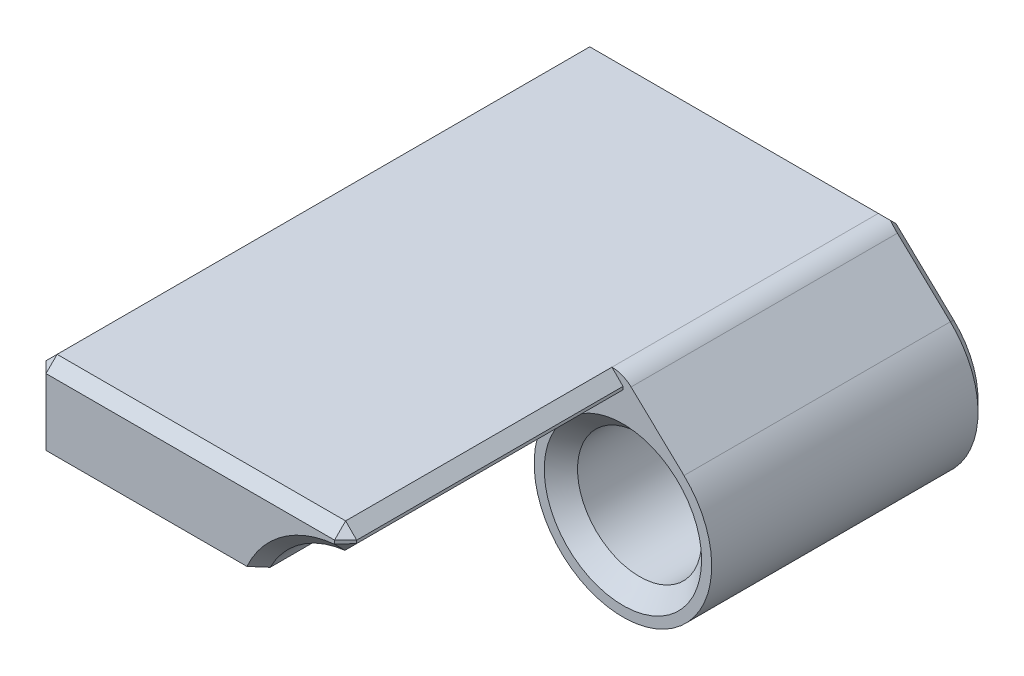
ISO-10303-21;
HEADER;
FILE_DESCRIPTION(('STEP AP214'),'2;1');
FILE_NAME('part.step','',(''),(''),'','','');
FILE_SCHEMA(('AUTOMOTIVE_DESIGN { 1 0 10303 214 1 1 1 1 }'));
ENDSEC;
DATA;
#1=APPLICATION_CONTEXT('core data for automotive mechanical design processes');
#2=APPLICATION_PROTOCOL_DEFINITION('international standard','automotive_design',2000,#1);
#3=PRODUCT_CONTEXT('',#1,'mechanical');
#4=PRODUCT('Part','Part','',(#3));
#5=PRODUCT_RELATED_PRODUCT_CATEGORY('part','',(#4));
#6=PRODUCT_DEFINITION_FORMATION('','',#4);
#7=PRODUCT_DEFINITION_CONTEXT('part definition',#1,'design');
#8=PRODUCT_DEFINITION('design','',#6,#7);
#9=PRODUCT_DEFINITION_SHAPE('','',#8);
#10=(LENGTH_UNIT() NAMED_UNIT(*) SI_UNIT(.MILLI.,.METRE.));
#11=(NAMED_UNIT(*) PLANE_ANGLE_UNIT() SI_UNIT($,.RADIAN.));
#12=(NAMED_UNIT(*) SI_UNIT($,.STERADIAN.) SOLID_ANGLE_UNIT());
#13=UNCERTAINTY_MEASURE_WITH_UNIT(LENGTH_MEASURE(1.E-05),#10,'distance_accuracy_value','');
#14=(GEOMETRIC_REPRESENTATION_CONTEXT(3) GLOBAL_UNCERTAINTY_ASSIGNED_CONTEXT((#13)) GLOBAL_UNIT_ASSIGNED_CONTEXT((#10,
#11,#12)) REPRESENTATION_CONTEXT('',''));
#15=CARTESIAN_POINT('',(0.,0.,0.));
#16=DIRECTION('',(0.,0.,1.));
#17=DIRECTION('',(1.,0.,0.));
#18=AXIS2_PLACEMENT_3D('',#15,#16,#17);
#19=CARTESIAN_POINT('',(27.98957,-3.01623,25.));
#20=DIRECTION('',(0.,0.,-1.));
#21=DIRECTION('',(-1.,0.,0.));
#22=AXIS2_PLACEMENT_3D('',#19,#20,#21);
#23=CYLINDRICAL_SURFACE('',#22,5.59);
#24=CARTESIAN_POINT('',(27.98957,-3.01623,23.5));
#25=DIRECTION('',(0.,0.,1.));
#26=DIRECTION('',(1.,0.,0.));
#27=AXIS2_PLACEMENT_3D('',#24,#25,#26);
#28=CIRCLE('',#27,5.59);
#29=CARTESIAN_POINT('',(33.57957,-3.01623,23.5));
#30=VERTEX_POINT('',#29);
#31=EDGE_CURVE('E47',#30,#30,#28,.T.);
#32=ORIENTED_EDGE('',*,*,#31,.T.);
#33=EDGE_LOOP('',(#32));
#34=FACE_BOUND('',#33,.T.);
#35=CARTESIAN_POINT('',(27.98957,-3.01623,0.));
#36=DIRECTION('',(0.,0.,1.));
#37=DIRECTION('',(1.,0.,0.));
#38=AXIS2_PLACEMENT_3D('',#35,#36,#37);
#39=CIRCLE('',#38,5.59);
#40=CARTESIAN_POINT('',(33.57957,-3.01623,0.));
#41=VERTEX_POINT('',#40);
#42=EDGE_CURVE('E181',#41,#41,#39,.T.);
#43=ORIENTED_EDGE('',*,*,#42,.F.);
#44=EDGE_LOOP('',(#43));
#45=FACE_BOUND('',#44,.T.);
#46=ADVANCED_FACE('F38',(#34,#45),#23,.F.);
#47=CARTESIAN_POINT('',(0.,0.,50.));
#48=DIRECTION('',(0.,1.,0.));
#49=DIRECTION('',(0.,0.,1.));
#50=AXIS2_PLACEMENT_3D('',#47,#48,#49);
#51=PLANE('',#50);
#52=DIRECTION('',(1.,0.,0.));
#53=VECTOR('',#52,1.);
#54=CARTESIAN_POINT('',(0.,0.,25.));
#55=LINE('',#54,#53);
#56=CARTESIAN_POINT('',(18.0923590562145,0.,25.));
#57=VERTEX_POINT('',#56);
#58=CARTESIAN_POINT('',(20.579957554865,0.,25.));
#59=VERTEX_POINT('',#58);
#60=EDGE_CURVE('E169',#57,#59,#55,.T.);
#61=ORIENTED_EDGE('',*,*,#60,.F.);
#62=DIRECTION('',(0.,0.,1.));
#63=VECTOR('',#62,1.);
#64=CARTESIAN_POINT('',(18.0923590562145,0.,50.));
#65=LINE('',#64,#63);
#66=CARTESIAN_POINT('',(18.0923590562145,0.,49.));
#67=VERTEX_POINT('',#66);
#68=EDGE_CURVE('E217',#57,#67,#65,.T.);
#69=ORIENTED_EDGE('',*,*,#68,.T.);
#70=DIRECTION('',(-1.,0.,0.));
#71=VECTOR('',#70,1.);
#72=CARTESIAN_POINT('',(0.,0.,49.));
#73=LINE('',#72,#71);
#74=CARTESIAN_POINT('',(1.,0.,49.));
#75=VERTEX_POINT('',#74);
#76=EDGE_CURVE('E204',#67,#75,#73,.T.);
#77=ORIENTED_EDGE('',*,*,#76,.T.);
#78=DIRECTION('',(0.,0.,-1.));
#79=VECTOR('',#78,1.);
#80=CARTESIAN_POINT('',(1.,0.,50.));
#81=LINE('',#80,#79);
#82=CARTESIAN_POINT('',(1.,0.,1.));
#83=VERTEX_POINT('',#82);
#84=EDGE_CURVE('E212',#75,#83,#81,.T.);
#85=ORIENTED_EDGE('',*,*,#84,.T.);
#86=DIRECTION('',(1.,0.,0.));
#87=VECTOR('',#86,1.);
#88=CARTESIAN_POINT('',(20.579957554865,0.,1.));
#89=LINE('',#88,#87);
#90=CARTESIAN_POINT('',(20.579957554865,0.,1.));
#91=VERTEX_POINT('',#90);
#92=EDGE_CURVE('E197',#83,#91,#89,.T.);
#93=ORIENTED_EDGE('',*,*,#92,.T.);
#94=DIRECTION('',(0.,0.,-1.));
#95=VECTOR('',#94,1.);
#96=CARTESIAN_POINT('',(20.579957554865,0.,25.));
#97=LINE('',#96,#95);
#98=EDGE_CURVE('E188',#59,#91,#97,.T.);
#99=ORIENTED_EDGE('',*,*,#98,.F.);
#100=EDGE_LOOP('',(#61,#69,#77,#85,#93,#99));
#101=FACE_BOUND('',#100,.T.);
#102=ADVANCED_FACE('F195',(#101),#51,.F.);
#103=CARTESIAN_POINT('',(28.,0.,50.));
#104=DIRECTION('',(-1.,0.,0.));
#105=DIRECTION('',(0.,0.,1.));
#106=AXIS2_PLACEMENT_3D('',#103,#104,#105);
#107=PLANE('',#106);
#108=DIRECTION('',(0.,-1.,0.));
#109=VECTOR('',#108,1.);
#110=CARTESIAN_POINT('',(28.,0.,49.));
#111=LINE('',#110,#109);
#112=CARTESIAN_POINT('',(28.,6.99999999999999,49.));
#113=VERTEX_POINT('',#112);
#114=CARTESIAN_POINT('',(28.,6.73257391163224,49.));
#115=VERTEX_POINT('',#114);
#116=EDGE_CURVE('E232',#113,#115,#111,.T.);
#117=ORIENTED_EDGE('',*,*,#116,.T.);
#118=DIRECTION('',(0.,0.,-1.));
#119=VECTOR('',#118,1.);
#120=CARTESIAN_POINT('',(28.,6.73257391163224,50.));
#121=LINE('',#120,#119);
#122=CARTESIAN_POINT('',(28.,6.73257391163224,25.));
#123=VERTEX_POINT('',#122);
#124=EDGE_CURVE('E235',#115,#123,#121,.T.);
#125=ORIENTED_EDGE('',*,*,#124,.T.);
#126=DIRECTION('',(0.,-1.,0.));
#127=VECTOR('',#126,1.);
#128=CARTESIAN_POINT('',(28.,8.,25.));
#129=LINE('',#128,#127);
#130=CARTESIAN_POINT('',(28.,6.99999999999999,25.));
#131=VERTEX_POINT('',#130);
#132=EDGE_CURVE('E206',#131,#123,#129,.T.);
#133=ORIENTED_EDGE('',*,*,#132,.F.);
#134=DIRECTION('',(0.,0.,1.));
#135=VECTOR('',#134,1.);
#136=CARTESIAN_POINT('',(28.,6.99999999999999,50.));
#137=LINE('',#136,#135);
#138=EDGE_CURVE('E229',#131,#113,#137,.T.);
#139=ORIENTED_EDGE('',*,*,#138,.T.);
#140=EDGE_LOOP('',(#117,#125,#133,#139));
#141=FACE_BOUND('',#140,.T.);
#142=ADVANCED_FACE('F451',(#141),#107,.F.);
#143=CARTESIAN_POINT('',(0.,0.,0.));
#144=DIRECTION('',(0.,0.,-1.));
#145=DIRECTION('',(-1.,0.,0.));
#146=AXIS2_PLACEMENT_3D('',#143,#144,#145);
#147=PLANE('',#146);
#148=DIRECTION('',(0.,-1.,0.));
#149=VECTOR('',#148,1.);
#150=CARTESIAN_POINT('',(0.,0.,0.));
#151=LINE('',#150,#149);
#152=CARTESIAN_POINT('',(0.,6.99999999999999,0.));
#153=VERTEX_POINT('',#152);
#154=CARTESIAN_POINT('',(0.,1.00000000000001,0.));
#155=VERTEX_POINT('',#154);
#156=EDGE_CURVE('E199',#153,#155,#151,.T.);
#157=ORIENTED_EDGE('',*,*,#156,.F.);
#158=DIRECTION('',(1.,0.,0.));
#159=VECTOR('',#158,1.);
#160=CARTESIAN_POINT('',(28.,6.99999999999999,0.));
#161=LINE('',#160,#159);
#162=CARTESIAN_POINT('',(27.6011880921064,6.99999999999999,0.));
#163=VERTEX_POINT('',#162);
#164=EDGE_CURVE('E251',#153,#163,#161,.T.);
#165=ORIENTED_EDGE('',*,*,#164,.T.);
#166=DIRECTION('',(0.725549701605073,-0.688169768662348,0.));
#167=VECTOR('',#166,1.);
#168=CARTESIAN_POINT('',(32.8067583806364,2.0626179112355,0.));
#169=LINE('',#168,#167);
#170=CARTESIAN_POINT('',(32.8067583806364,2.0626179112355,0.));
#171=VERTEX_POINT('',#170);
#172=EDGE_CURVE('E247',#163,#171,#169,.T.);
#173=ORIENTED_EDGE('',*,*,#172,.T.);
#174=CARTESIAN_POINT('',(27.98957,-3.01623,0.));
#175=DIRECTION('',(0.,0.,-1.));
#176=DIRECTION('',(-1.,0.,0.));
#177=AXIS2_PLACEMENT_3D('',#174,#175,#176);
#178=CIRCLE('',#177,6.99999999999999);
#179=CARTESIAN_POINT('',(22.2563425854367,1.00000000000001,0.));
#180=VERTEX_POINT('',#179);
#181=EDGE_CURVE('E244',#171,#180,#178,.T.);
#182=ORIENTED_EDGE('',*,*,#181,.T.);
#183=DIRECTION('',(-1.,0.,0.));
#184=VECTOR('',#183,1.);
#185=CARTESIAN_POINT('',(0.,1.00000000000001,0.));
#186=LINE('',#185,#184);
#187=EDGE_CURVE('E241',#180,#155,#186,.T.);
#188=ORIENTED_EDGE('',*,*,#187,.T.);
#189=EDGE_LOOP('',(#157,#165,#173,#182,#188));
#190=FACE_BOUND('',#189,.T.);
#191=ORIENTED_EDGE('',*,*,#42,.T.);
#192=EDGE_LOOP('',(#191));
#193=FACE_BOUND('',#192,.T.);
#194=ADVANCED_FACE('F469',(#190,#193),#147,.T.);
#195=CARTESIAN_POINT('',(0.,0.,50.));
#196=DIRECTION('',(1.,0.,0.));
#197=DIRECTION('',(0.,0.,-1.));
#198=AXIS2_PLACEMENT_3D('',#195,#196,#197);
#199=PLANE('',#198);
#200=DIRECTION('',(0.,1.,0.));
#201=VECTOR('',#200,1.);
#202=CARTESIAN_POINT('',(0.,0.,49.));
#203=LINE('',#202,#201);
#204=CARTESIAN_POINT('',(0.,1.00000000000001,49.));
#205=VERTEX_POINT('',#204);
#206=CARTESIAN_POINT('',(0.,6.99999999999999,49.));
#207=VERTEX_POINT('',#206);
#208=EDGE_CURVE('E274',#205,#207,#203,.T.);
#209=ORIENTED_EDGE('',*,*,#208,.T.);
#210=DIRECTION('',(0.,0.,-1.));
#211=VECTOR('',#210,1.);
#212=CARTESIAN_POINT('',(0.,6.99999999999999,50.));
#213=LINE('',#212,#211);
#214=EDGE_CURVE('E277',#207,#153,#213,.T.);
#215=ORIENTED_EDGE('',*,*,#214,.T.);
#216=ORIENTED_EDGE('',*,*,#156,.T.);
#217=DIRECTION('',(0.,0.,1.));
#218=VECTOR('',#217,1.);
#219=CARTESIAN_POINT('',(0.,1.00000000000001,50.));
#220=LINE('',#219,#218);
#221=EDGE_CURVE('E271',#155,#205,#220,.T.);
#222=ORIENTED_EDGE('',*,*,#221,.T.);
#223=EDGE_LOOP('',(#209,#215,#216,#222));
#224=FACE_BOUND('',#223,.T.);
#225=ADVANCED_FACE('F472',(#224),#199,.F.);
#226=CARTESIAN_POINT('',(0.,8.,50.));
#227=DIRECTION('',(0.,-1.,0.));
#228=DIRECTION('',(0.,0.,-1.));
#229=AXIS2_PLACEMENT_3D('',#226,#227,#228);
#230=PLANE('',#229);
#231=DIRECTION('',(1.,0.,0.));
#232=VECTOR('',#231,1.);
#233=CARTESIAN_POINT('',(27.98957,8.,25.));
#234=LINE('',#233,#232);
#235=CARTESIAN_POINT('',(27.,8.,25.));
#236=VERTEX_POINT('',#235);
#237=CARTESIAN_POINT('',(27.002970230266,8.,25.));
#238=VERTEX_POINT('',#237);
#239=EDGE_CURVE('E280',#236,#238,#234,.T.);
#240=ORIENTED_EDGE('',*,*,#239,.T.);
#241=DIRECTION('',(0.,0.,-1.));
#242=VECTOR('',#241,1.);
#243=CARTESIAN_POINT('',(27.002970230266,8.,50.));
#244=LINE('',#243,#242);
#245=CARTESIAN_POINT('',(27.002970230266,8.,1.));
#246=VERTEX_POINT('',#245);
#247=EDGE_CURVE('E308',#238,#246,#244,.T.);
#248=ORIENTED_EDGE('',*,*,#247,.T.);
#249=DIRECTION('',(-1.,0.,0.));
#250=VECTOR('',#249,1.);
#251=CARTESIAN_POINT('',(0.,8.,1.));
#252=LINE('',#251,#250);
#253=CARTESIAN_POINT('',(1.,8.,1.));
#254=VERTEX_POINT('',#253);
#255=EDGE_CURVE('E294',#246,#254,#252,.T.);
#256=ORIENTED_EDGE('',*,*,#255,.T.);
#257=DIRECTION('',(0.,0.,1.));
#258=VECTOR('',#257,1.);
#259=CARTESIAN_POINT('',(1.,8.,50.));
#260=LINE('',#259,#258);
#261=CARTESIAN_POINT('',(1.,8.,49.));
#262=VERTEX_POINT('',#261);
#263=EDGE_CURVE('E291',#254,#262,#260,.T.);
#264=ORIENTED_EDGE('',*,*,#263,.T.);
#265=DIRECTION('',(1.,0.,0.));
#266=VECTOR('',#265,1.);
#267=CARTESIAN_POINT('',(0.,8.,49.));
#268=LINE('',#267,#266);
#269=CARTESIAN_POINT('',(27.,8.,49.));
#270=VERTEX_POINT('',#269);
#271=EDGE_CURVE('E288',#262,#270,#268,.T.);
#272=ORIENTED_EDGE('',*,*,#271,.T.);
#273=DIRECTION('',(0.,0.,-1.));
#274=VECTOR('',#273,1.);
#275=CARTESIAN_POINT('',(27.,8.,50.));
#276=LINE('',#275,#274);
#277=EDGE_CURVE('E284',#270,#236,#276,.T.);
#278=ORIENTED_EDGE('',*,*,#277,.T.);
#279=EDGE_LOOP('',(#240,#248,#256,#264,#272,#278));
#280=FACE_BOUND('',#279,.T.);
#281=ADVANCED_FACE('F467',(#280),#230,.F.);
#282=CARTESIAN_POINT('',(0.,0.,50.));
#283=DIRECTION('',(0.,0.,-1.));
#284=DIRECTION('',(-1.,0.,0.));
#285=AXIS2_PLACEMENT_3D('',#282,#283,#284);
#286=PLANE('',#285);
#287=DIRECTION('',(-1.,0.,0.));
#288=VECTOR('',#287,1.);
#289=CARTESIAN_POINT('',(0.,6.99999999999999,50.));
#290=LINE('',#289,#288);
#291=CARTESIAN_POINT('',(27.,6.99999999999999,50.));
#292=VERTEX_POINT('',#291);
#293=CARTESIAN_POINT('',(1.,6.99999999999999,50.));
#294=VERTEX_POINT('',#293);
#295=EDGE_CURVE('E264',#292,#294,#290,.T.);
#296=ORIENTED_EDGE('',*,*,#295,.T.);
#297=DIRECTION('',(0.,-1.,0.));
#298=VECTOR('',#297,1.);
#299=CARTESIAN_POINT('',(1.,0.,50.));
#300=LINE('',#299,#298);
#301=CARTESIAN_POINT('',(1.,1.,50.));
#302=VERTEX_POINT('',#301);
#303=EDGE_CURVE('E267',#294,#302,#300,.T.);
#304=ORIENTED_EDGE('',*,*,#303,.T.);
#305=DIRECTION('',(1.,0.,0.));
#306=VECTOR('',#305,1.);
#307=CARTESIAN_POINT('',(0.,1.,50.));
#308=LINE('',#307,#306);
#309=CARTESIAN_POINT('',(19.1051793857204,1.,50.));
#310=VERTEX_POINT('',#309);
#311=EDGE_CURVE('E261',#302,#310,#308,.T.);
#312=ORIENTED_EDGE('',*,*,#311,.T.);
#313=CARTESIAN_POINT('',(27.98957,-3.01623,50.));
#314=DIRECTION('',(0.,0.,-1.));
#315=DIRECTION('',(-1.,0.,0.));
#316=AXIS2_PLACEMENT_3D('',#313,#314,#315);
#317=CIRCLE('',#316,9.75000000000001);
#318=CARTESIAN_POINT('',(27.,6.68342211825147,50.));
#319=VERTEX_POINT('',#318);
#320=EDGE_CURVE('E258',#310,#319,#317,.T.);
#321=ORIENTED_EDGE('',*,*,#320,.T.);
#322=DIRECTION('',(0.,1.,0.));
#323=VECTOR('',#322,1.);
#324=CARTESIAN_POINT('',(27.,0.,50.));
#325=LINE('',#324,#323);
#326=EDGE_CURVE('E255',#319,#292,#325,.T.);
#327=ORIENTED_EDGE('',*,*,#326,.T.);
#328=EDGE_LOOP('',(#296,#304,#312,#321,#327));
#329=FACE_BOUND('',#328,.T.);
#330=ADVANCED_FACE('F458',(#329),#286,.F.);
#331=CARTESIAN_POINT('',(27.98957,-3.01623,25.));
#332=DIRECTION('',(0.,0.,1.));
#333=DIRECTION('',(1.,0.,0.));
#334=AXIS2_PLACEMENT_3D('',#331,#332,#333);
#335=PLANE('',#334);
#336=CARTESIAN_POINT('',(27.98957,-3.01623,25.));
#337=DIRECTION('',(0.,0.,1.));
#338=DIRECTION('',(1.,0.,0.));
#339=AXIS2_PLACEMENT_3D('',#336,#337,#338);
#340=CIRCLE('',#339,7.09);
#341=CARTESIAN_POINT('',(35.07957,-3.01623,25.));
#342=VERTEX_POINT('',#341);
#343=EDGE_CURVE('E11',#342,#342,#340,.F.);
#344=ORIENTED_EDGE('',*,*,#343,.T.);
#345=EDGE_LOOP('',(#344));
#346=FACE_BOUND('',#345,.T.);
#347=DIRECTION('',(-0.725549701605073,0.688169768662348,0.));
#348=VECTOR('',#347,1.);
#349=CARTESIAN_POINT('',(33.4949281492988,2.78816761284058,25.));
#350=LINE('',#349,#348);
#351=CARTESIAN_POINT('',(33.4949281492988,2.78816761284058,25.));
#352=VERTEX_POINT('',#351);
#353=CARTESIAN_POINT('',(28.7233946519219,7.31387425401268,25.));
#354=VERTEX_POINT('',#353);
#355=EDGE_CURVE('E193',#352,#354,#350,.T.);
#356=ORIENTED_EDGE('',*,*,#355,.T.);
#357=CARTESIAN_POINT('',(27.002970230266,5.5,25.));
#358=DIRECTION('',(0.,0.,1.));
#359=DIRECTION('',(1.,0.,0.));
#360=AXIS2_PLACEMENT_3D('',#357,#358,#359);
#361=CIRCLE('',#360,2.5);
#362=EDGE_CURVE('E543',#354,#238,#361,.T.);
#363=ORIENTED_EDGE('',*,*,#362,.T.);
#364=ORIENTED_EDGE('',*,*,#239,.F.);
#365=DIRECTION('',(-0.707106781186545,0.70710678118655,0.));
#366=VECTOR('',#365,1.);
#367=CARTESIAN_POINT('',(27.,8.,25.));
#368=LINE('',#367,#366);
#369=EDGE_CURVE('E305',#236,#131,#368,.F.);
#370=ORIENTED_EDGE('',*,*,#369,.T.);
#371=ORIENTED_EDGE('',*,*,#132,.T.);
#372=DIRECTION('',(-0.707949150118259,-0.70626340755191,0.));
#373=VECTOR('',#372,1.);
#374=CARTESIAN_POINT('',(28.,6.73257391163224,25.));
#375=LINE('',#374,#373);
#376=CARTESIAN_POINT('',(26.9348608658816,5.66997104777728,25.));
#377=VERTEX_POINT('',#376);
#378=EDGE_CURVE('E302',#123,#377,#375,.T.);
#379=ORIENTED_EDGE('',*,*,#378,.T.);
#380=CARTESIAN_POINT('',(27.98957,-3.01623,25.));
#381=DIRECTION('',(0.,0.,1.));
#382=DIRECTION('',(1.,0.,0.));
#383=AXIS2_PLACEMENT_3D('',#380,#381,#382);
#384=CIRCLE('',#383,8.75);
#385=CARTESIAN_POINT('',(20.2040850118995,0.977355293950992,25.));
#386=VERTEX_POINT('',#385);
#387=EDGE_CURVE('E182',#386,#377,#384,.F.);
#388=ORIENTED_EDGE('',*,*,#387,.F.);
#389=DIRECTION('',(0.907515334552353,0.420018949039601,0.));
#390=VECTOR('',#389,1.);
#391=CARTESIAN_POINT('',(18.0923590562145,0.,25.));
#392=LINE('',#391,#390);
#393=EDGE_CURVE('E175',#386,#57,#392,.F.);
#394=ORIENTED_EDGE('',*,*,#393,.T.);
#395=ORIENTED_EDGE('',*,*,#60,.T.);
#396=CARTESIAN_POINT('',(27.98957,-3.01623,25.));
#397=DIRECTION('',(0.,0.,1.));
#398=DIRECTION('',(1.,0.,0.));
#399=AXIS2_PLACEMENT_3D('',#396,#397,#398);
#400=CIRCLE('',#399,8.);
#401=EDGE_CURVE('E172',#59,#352,#400,.T.);
#402=ORIENTED_EDGE('',*,*,#401,.T.);
#403=EDGE_LOOP('',(#356,#363,#364,#370,#371,#379,#388,#394,#395,#402));
#404=FACE_BOUND('',#403,.T.);
#405=ADVANCED_FACE('F171',(#346,#404),#335,.T.);
#406=CARTESIAN_POINT('',(27.98957,-3.01623,25.));
#407=DIRECTION('',(0.,0.,-1.));
#408=DIRECTION('',(-1.,0.,0.));
#409=AXIS2_PLACEMENT_3D('',#406,#407,#408);
#410=CYLINDRICAL_SURFACE('',#409,8.);
#411=ORIENTED_EDGE('',*,*,#98,.T.);
#412=CARTESIAN_POINT('',(27.98957,-3.01623,1.));
#413=DIRECTION('',(0.,0.,-1.));
#414=DIRECTION('',(-1.,0.,0.));
#415=AXIS2_PLACEMENT_3D('',#412,#413,#414);
#416=CIRCLE('',#415,8.);
#417=CARTESIAN_POINT('',(33.4949281492988,2.78816761284058,1.));
#418=VERTEX_POINT('',#417);
#419=EDGE_CURVE('E297',#91,#418,#416,.F.);
#420=ORIENTED_EDGE('',*,*,#419,.T.);
#421=DIRECTION('',(0.,0.,-1.));
#422=VECTOR('',#421,1.);
#423=CARTESIAN_POINT('',(33.4949281492988,2.78816761284058,25.));
#424=LINE('',#423,#422);
#425=EDGE_CURVE('E191',#352,#418,#424,.T.);
#426=ORIENTED_EDGE('',*,*,#425,.F.);
#427=ORIENTED_EDGE('',*,*,#401,.F.);
#428=EDGE_LOOP('',(#411,#420,#426,#427));
#429=FACE_BOUND('',#428,.T.);
#430=ADVANCED_FACE('F187',(#429),#410,.T.);
#431=CARTESIAN_POINT('',(33.4949281492988,2.78816761284058,25.));
#432=DIRECTION('',(-0.688169768662348,-0.725549701605073,0.));
#433=DIRECTION('',(0.725549701605073,-0.688169768662348,0.));
#434=AXIS2_PLACEMENT_3D('',#431,#432,#433);
#435=PLANE('',#434);
#436=DIRECTION('',(-0.725549701605073,0.688169768662348,0.));
#437=VECTOR('',#436,1.);
#438=CARTESIAN_POINT('',(28.,8.,1.));
#439=LINE('',#438,#437);
#440=CARTESIAN_POINT('',(28.7233946519219,7.31387425401268,1.));
#441=VERTEX_POINT('',#440);
#442=EDGE_CURVE('E238',#418,#441,#439,.T.);
#443=ORIENTED_EDGE('',*,*,#442,.T.);
#444=DIRECTION('',(0.,0.,-1.));
#445=VECTOR('',#444,1.);
#446=CARTESIAN_POINT('',(28.7233946519219,7.31387425401268,25.));
#447=LINE('',#446,#445);
#448=EDGE_CURVE('E54',#441,#354,#447,.F.);
#449=ORIENTED_EDGE('',*,*,#448,.T.);
#450=ORIENTED_EDGE('',*,*,#355,.F.);
#451=ORIENTED_EDGE('',*,*,#425,.T.);
#452=EDGE_LOOP('',(#443,#449,#450,#451));
#453=FACE_BOUND('',#452,.T.);
#454=ADVANCED_FACE('F460',(#453),#435,.F.);
#455=CARTESIAN_POINT('',(27.98957,-3.01623,0.251262658470842));
#456=DIRECTION('',(0.,0.,1.));
#457=DIRECTION('',(1.,0.,0.));
#458=AXIS2_PLACEMENT_3D('',#455,#456,#457);
#459=CYLINDRICAL_SURFACE('',#458,8.75);
#460=CARTESIAN_POINT('',(27.98957,-3.01623,49.));
#461=DIRECTION('',(0.,0.,-1.));
#462=DIRECTION('',(-1.,0.,0.));
#463=AXIS2_PLACEMENT_3D('',#460,#461,#462);
#464=CIRCLE('',#463,8.75);
#465=CARTESIAN_POINT('',(26.9348608658816,5.66997104777728,49.));
#466=VERTEX_POINT('',#465);
#467=CARTESIAN_POINT('',(20.2040850118995,0.977355293950991,49.));
#468=VERTEX_POINT('',#467);
#469=EDGE_CURVE('E220',#466,#468,#464,.F.);
#470=ORIENTED_EDGE('',*,*,#469,.T.);
#471=DIRECTION('',(0.,0.,1.));
#472=VECTOR('',#471,1.);
#473=CARTESIAN_POINT('',(20.2040850118995,0.977355293950992,0.251262658470842));
#474=LINE('',#473,#472);
#475=EDGE_CURVE('E226',#468,#386,#474,.F.);
#476=ORIENTED_EDGE('',*,*,#475,.T.);
#477=ORIENTED_EDGE('',*,*,#387,.T.);
#478=DIRECTION('',(0.,0.,1.));
#479=VECTOR('',#478,1.);
#480=CARTESIAN_POINT('',(26.9348608658816,5.66997104777728,0.251262658470842));
#481=LINE('',#480,#479);
#482=EDGE_CURVE('E223',#377,#466,#481,.T.);
#483=ORIENTED_EDGE('',*,*,#482,.T.);
#484=EDGE_LOOP('',(#470,#476,#477,#483));
#485=FACE_BOUND('',#484,.T.);
#486=ADVANCED_FACE('F432',(#485),#459,.F.);
#487=CARTESIAN_POINT('',(33.4949281492988,2.78816761284058,1.));
#488=DIRECTION('',(0.486609510028721,0.513041114092821,-0.707106781186551));
#489=DIRECTION('',(0.725549701605073,-0.688169768662348,0.));
#490=AXIS2_PLACEMENT_3D('',#487,#488,#489);
#491=PLANE('',#490);
#492=DIRECTION('',(-0.271416766874161,-0.680563347036697,-0.680563347036692));
#493=VECTOR('',#492,1.);
#494=CARTESIAN_POINT('',(25.9373222824682,2.82794350743877,-4.17205649256119));
#495=LINE('',#494,#493);
#496=CARTESIAN_POINT('',(27.9290680558137,7.82214185990345,0.822141859903453));
#497=VERTEX_POINT('',#496);
#498=EDGE_CURVE('E523',#497,#163,#495,.T.);
#499=ORIENTED_EDGE('',*,*,#498,.F.);
#500=CARTESIAN_POINT('',(27.002970230266,5.5,-1.49999999999997));
#501=DIRECTION('',(0.486609510028721,0.513041114092821,-0.707106781186551));
#502=DIRECTION('',(-0.486609510028726,-0.513041114092826,-0.707106781186544));
#503=AXIS2_PLACEMENT_3D('',#500,#501,#502);
#504=ELLIPSE('',#503,3.53553390593272,2.5);
#505=EDGE_CURVE('E62',#497,#441,#504,.T.);
#506=ORIENTED_EDGE('',*,*,#505,.T.);
#507=ORIENTED_EDGE('',*,*,#442,.F.);
#508=DIRECTION('',(0.486609510028724,0.513041114092826,0.707106781186545));
#509=VECTOR('',#508,1.);
#510=CARTESIAN_POINT('',(32.8067583806364,2.0626179112355,0.));
#511=LINE('',#510,#509);
#512=EDGE_CURVE('E527',#171,#418,#511,.T.);
#513=ORIENTED_EDGE('',*,*,#512,.F.);
#514=ORIENTED_EDGE('',*,*,#172,.F.);
#515=EDGE_LOOP('',(#499,#506,#507,#513,#514));
#516=FACE_BOUND('',#515,.T.);
#517=ADVANCED_FACE('F429',(#516),#491,.T.);
#518=CARTESIAN_POINT('',(0.,8.,1.));
#519=DIRECTION('',(0.,0.707106781186545,-0.70710678118655));
#520=DIRECTION('',(1.,0.,0.));
#521=AXIS2_PLACEMENT_3D('',#518,#519,#520);
#522=PLANE('',#521);
#523=ORIENTED_EDGE('',*,*,#255,.F.);
#524=CARTESIAN_POINT('',(27.002970230266,5.5,-1.49999999999997));
#525=DIRECTION('',(0.,0.707106781186545,-0.70710678118655));
#526=DIRECTION('',(0.,-0.70710678118655,-0.707106781186545));
#527=AXIS2_PLACEMENT_3D('',#524,#525,#526);
#528=ELLIPSE('',#527,3.53553390593273,2.5);
#529=EDGE_CURVE('E536',#246,#497,#528,.T.);
#530=ORIENTED_EDGE('',*,*,#529,.T.);
#531=ORIENTED_EDGE('',*,*,#498,.T.);
#532=ORIENTED_EDGE('',*,*,#164,.F.);
#533=DIRECTION('',(0.577350269189624,0.577350269189628,0.577350269189624));
#534=VECTOR('',#533,1.);
#535=CARTESIAN_POINT('',(16.6666666666666,23.6666666666667,16.6666666666666));
#536=LINE('',#535,#534);
#537=EDGE_CURVE('E403',#254,#153,#536,.F.);
#538=ORIENTED_EDGE('',*,*,#537,.F.);
#539=EDGE_LOOP('',(#523,#530,#531,#532,#538));
#540=FACE_BOUND('',#539,.T.);
#541=ADVANCED_FACE('F426',(#540),#522,.T.);
#542=CARTESIAN_POINT('',(27.98957,-3.01623,1.));
#543=DIRECTION('',(0.,0.,1.));
#544=DIRECTION('',(1.,0.,0.));
#545=AXIS2_PLACEMENT_3D('',#542,#543,#544);
#546=CONICAL_SURFACE('',#545,8.,0.785398163397453);
#547=ORIENTED_EDGE('',*,*,#512,.T.);
#548=ORIENTED_EDGE('',*,*,#419,.F.);
#549=CARTESIAN_POINT('',(22.2563425854367,1.00000000000001,0.));
#550=CARTESIAN_POINT('',(22.108956829709,0.923289428215492,0.0767105717845151));
#551=CARTESIAN_POINT('',(21.9635746306096,0.844675675857951,0.155324324142056));
#552=CARTESIAN_POINT('',(21.6768089212252,0.68408043357215,0.315919566427856));
#553=CARTESIAN_POINT('',(21.5354216090191,0.60210234118668,0.397897658813325));
#554=CARTESIAN_POINT('',(21.256371057648,0.435078633134846,0.564921366865158));
#555=CARTESIAN_POINT('',(21.1187071846966,0.350033545342007,0.649966454657997));
#556=CARTESIAN_POINT('',(20.8467821871574,0.177075602728994,0.822924397271008));
#557=CARTESIAN_POINT('',(20.7125245540218,0.0891600011294789,0.910839998870522));
#558=CARTESIAN_POINT('',(20.579957554865,0.,1.));
#559=B_SPLINE_CURVE_WITH_KNOTS('',3,(#549,#550,#551,#552,#553,#554,#555,#556,#557,#558),
.UNSPECIFIED.,.F.,.F.,(4,2,2,2,4),(0.,0.548964455894611,1.09738755093459,1.6457167008773,
2.19458687735224),.UNSPECIFIED.);
#560=EDGE_CURVE('E393',#180,#91,#559,.T.);
#561=ORIENTED_EDGE('',*,*,#560,.F.);
#562=ORIENTED_EDGE('',*,*,#181,.F.);
#563=EDGE_LOOP('',(#547,#548,#561,#562));
#564=FACE_BOUND('',#563,.T.);
#565=ADVANCED_FACE('F405',(#564),#546,.T.);
#566=CARTESIAN_POINT('',(0.,6.99999999999999,50.));
#567=DIRECTION('',(0.70710678118655,-0.707106781186545,0.));
#568=DIRECTION('',(0.,0.,-1.));
#569=AXIS2_PLACEMENT_3D('',#566,#567,#568);
#570=PLANE('',#569);
#571=ORIENTED_EDGE('',*,*,#537,.T.);
#572=ORIENTED_EDGE('',*,*,#214,.F.);
#573=DIRECTION('',(0.707106781186545,0.70710678118655,0.));
#574=VECTOR('',#573,1.);
#575=CARTESIAN_POINT('',(0.,6.99999999999999,49.));
#576=LINE('',#575,#574);
#577=EDGE_CURVE('E389',#262,#207,#576,.F.);
#578=ORIENTED_EDGE('',*,*,#577,.F.);
#579=ORIENTED_EDGE('',*,*,#263,.F.);
#580=EDGE_LOOP('',(#571,#572,#578,#579));
#581=FACE_BOUND('',#580,.T.);
#582=ADVANCED_FACE('F421',(#581),#570,.F.);
#583=CARTESIAN_POINT('',(0.,6.99999999999999,50.));
#584=DIRECTION('',(0.,-0.707106781186545,-0.70710678118655));
#585=DIRECTION('',(-1.,0.,0.));
#586=AXIS2_PLACEMENT_3D('',#583,#584,#585);
#587=PLANE('',#586);
#588=DIRECTION('',(0.,0.70710678118655,-0.707106781186545));
#589=VECTOR('',#588,1.);
#590=CARTESIAN_POINT('',(27.,8.,49.));
#591=LINE('',#590,#589);
#592=EDGE_CURVE('E381',#270,#292,#591,.F.);
#593=ORIENTED_EDGE('',*,*,#592,.F.);
#594=ORIENTED_EDGE('',*,*,#271,.F.);
#595=DIRECTION('',(0.,-0.70710678118655,0.707106781186545));
#596=VECTOR('',#595,1.);
#597=CARTESIAN_POINT('',(1.,7.5,49.5));
#598=LINE('',#597,#596);
#599=EDGE_CURVE('E385',#294,#262,#598,.F.);
#600=ORIENTED_EDGE('',*,*,#599,.F.);
#601=ORIENTED_EDGE('',*,*,#295,.F.);
#602=EDGE_LOOP('',(#593,#594,#600,#601));
#603=FACE_BOUND('',#602,.T.);
#604=ADVANCED_FACE('F417',(#603),#587,.F.);
#605=CARTESIAN_POINT('',(27.,8.,50.));
#606=DIRECTION('',(-0.70710678118655,-0.707106781186545,0.));
#607=DIRECTION('',(0.,0.,-1.));
#608=AXIS2_PLACEMENT_3D('',#605,#606,#607);
#609=PLANE('',#608);
#610=ORIENTED_EDGE('',*,*,#369,.F.);
#611=ORIENTED_EDGE('',*,*,#277,.F.);
#612=DIRECTION('',(0.707106781186545,-0.70710678118655,0.));
#613=VECTOR('',#612,1.);
#614=CARTESIAN_POINT('',(27.,8.,49.));
#615=LINE('',#614,#613);
#616=EDGE_CURVE('E377',#113,#270,#615,.F.);
#617=ORIENTED_EDGE('',*,*,#616,.F.);
#618=ORIENTED_EDGE('',*,*,#138,.F.);
#619=EDGE_LOOP('',(#610,#611,#617,#618));
#620=FACE_BOUND('',#619,.T.);
#621=ADVANCED_FACE('F413',(#620),#609,.F.);
#622=CARTESIAN_POINT('',(0.,0.,1.));
#623=DIRECTION('',(0.,-0.707106781186545,-0.70710678118655));
#624=DIRECTION('',(-1.,0.,0.));
#625=AXIS2_PLACEMENT_3D('',#622,#623,#624);
#626=PLANE('',#625);
#627=ORIENTED_EDGE('',*,*,#560,.T.);
#628=ORIENTED_EDGE('',*,*,#92,.F.);
#629=DIRECTION('',(-0.577350269189624,0.577350269189628,-0.577350269189624));
#630=VECTOR('',#629,1.);
#631=CARTESIAN_POINT('',(17.3333333333333,-16.3333333333334,17.3333333333333));
#632=LINE('',#631,#630);
#633=EDGE_CURVE('E373',#155,#83,#632,.F.);
#634=ORIENTED_EDGE('',*,*,#633,.F.);
#635=ORIENTED_EDGE('',*,*,#187,.F.);
#636=EDGE_LOOP('',(#627,#628,#634,#635));
#637=FACE_BOUND('',#636,.T.);
#638=ADVANCED_FACE('F408',(#637),#626,.T.);
#639=CARTESIAN_POINT('',(0.,6.99999999999999,49.));
#640=DIRECTION('',(-0.57735026918963,0.577350269189622,0.577350269189626));
#641=DIRECTION('',(0.707106781186545,0.,0.70710678118655));
#642=AXIS2_PLACEMENT_3D('',#639,#640,#641);
#643=PLANE('',#642);
#644=ORIENTED_EDGE('',*,*,#599,.T.);
#645=ORIENTED_EDGE('',*,*,#577,.T.);
#646=DIRECTION('',(-0.707106781186545,0.,-0.70710678118655));
#647=VECTOR('',#646,1.);
#648=CARTESIAN_POINT('',(0.,6.99999999999999,49.));
#649=LINE('',#648,#647);
#650=EDGE_CURVE('E369',#294,#207,#649,.T.);
#651=ORIENTED_EDGE('',*,*,#650,.F.);
#652=EDGE_LOOP('',(#644,#645,#651));
#653=FACE_BOUND('',#652,.T.);
#654=ADVANCED_FACE('F412',(#653),#643,.T.);
#655=CARTESIAN_POINT('',(27.,8.,49.));
#656=DIRECTION('',(0.57735026918963,0.577350269189622,0.577350269189626));
#657=DIRECTION('',(0.707106781186545,0.,-0.70710678118655));
#658=AXIS2_PLACEMENT_3D('',#655,#656,#657);
#659=PLANE('',#658);
#660=ORIENTED_EDGE('',*,*,#616,.T.);
#661=ORIENTED_EDGE('',*,*,#592,.T.);
#662=DIRECTION('',(-0.707106781186545,0.,0.70710678118655));
#663=VECTOR('',#662,1.);
#664=CARTESIAN_POINT('',(27.5,6.99999999999999,49.5));
#665=LINE('',#664,#663);
#666=EDGE_CURVE('E365',#113,#292,#665,.T.);
#667=ORIENTED_EDGE('',*,*,#666,.F.);
#668=EDGE_LOOP('',(#660,#661,#667));
#669=FACE_BOUND('',#668,.T.);
#670=ADVANCED_FACE('F577',(#669),#659,.T.);
#671=CARTESIAN_POINT('',(1.,0.,50.));
#672=DIRECTION('',(0.70710678118655,0.707106781186545,0.));
#673=DIRECTION('',(0.,0.,-1.));
#674=AXIS2_PLACEMENT_3D('',#671,#672,#673);
#675=PLANE('',#674);
#676=ORIENTED_EDGE('',*,*,#633,.T.);
#677=ORIENTED_EDGE('',*,*,#84,.F.);
#678=DIRECTION('',(-0.707106781186545,0.70710678118655,0.));
#679=VECTOR('',#678,1.);
#680=CARTESIAN_POINT('',(0.500000000000001,0.500000000000004,49.));
#681=LINE('',#680,#679);
#682=EDGE_CURVE('E361',#205,#75,#681,.F.);
#683=ORIENTED_EDGE('',*,*,#682,.F.);
#684=ORIENTED_EDGE('',*,*,#221,.F.);
#685=EDGE_LOOP('',(#676,#677,#683,#684));
#686=FACE_BOUND('',#685,.T.);
#687=ADVANCED_FACE('F579',(#686),#675,.F.);
#688=CARTESIAN_POINT('',(1.,0.,50.));
#689=DIRECTION('',(0.70710678118655,0.,-0.707106781186545));
#690=DIRECTION('',(0.,-1.,0.));
#691=AXIS2_PLACEMENT_3D('',#688,#689,#690);
#692=PLANE('',#691);
#693=ORIENTED_EDGE('',*,*,#650,.T.);
#694=ORIENTED_EDGE('',*,*,#208,.F.);
#695=DIRECTION('',(0.707106781186545,0.,0.70710678118655));
#696=VECTOR('',#695,1.);
#697=CARTESIAN_POINT('',(1.,1.,50.));
#698=LINE('',#697,#696);
#699=EDGE_CURVE('E357',#302,#205,#698,.F.);
#700=ORIENTED_EDGE('',*,*,#699,.F.);
#701=ORIENTED_EDGE('',*,*,#303,.F.);
#702=EDGE_LOOP('',(#693,#694,#700,#701));
#703=FACE_BOUND('',#702,.T.);
#704=ADVANCED_FACE('F499',(#703),#692,.F.);
#705=CARTESIAN_POINT('',(27.,0.,50.));
#706=DIRECTION('',(-0.70710678118655,0.,-0.707106781186545));
#707=DIRECTION('',(0.,1.,0.));
#708=AXIS2_PLACEMENT_3D('',#705,#706,#707);
#709=PLANE('',#708);
#710=ORIENTED_EDGE('',*,*,#666,.T.);
#711=ORIENTED_EDGE('',*,*,#326,.F.);
#712=DIRECTION('',(0.706680093106145,0.0347345939226627,-0.70668009310615));
#713=VECTOR('',#712,1.);
#714=CARTESIAN_POINT('',(27.4419900625029,6.70514672247997,49.5580099374971));
#715=LINE('',#714,#713);
#716=EDGE_CURVE('E353',#115,#319,#715,.F.);
#717=ORIENTED_EDGE('',*,*,#716,.F.);
#718=ORIENTED_EDGE('',*,*,#116,.F.);
#719=EDGE_LOOP('',(#710,#711,#717,#718));
#720=FACE_BOUND('',#719,.T.);
#721=ADVANCED_FACE('F574',(#720),#709,.F.);
#722=CARTESIAN_POINT('',(28.,6.73257391163224,0.251262658470842));
#723=DIRECTION('',(0.70626340755191,-0.707949150118259,0.));
#724=DIRECTION('',(0.,0.,1.));
#725=AXIS2_PLACEMENT_3D('',#722,#723,#724);
#726=PLANE('',#725);
#727=ORIENTED_EDGE('',*,*,#378,.F.);
#728=ORIENTED_EDGE('',*,*,#124,.F.);
#729=DIRECTION('',(0.707949150118259,0.70626340755191,0.));
#730=VECTOR('',#729,1.);
#731=CARTESIAN_POINT('',(26.9348608658816,5.66997104777728,49.));
#732=LINE('',#731,#730);
#733=EDGE_CURVE('E349',#466,#115,#732,.T.);
#734=ORIENTED_EDGE('',*,*,#733,.F.);
#735=ORIENTED_EDGE('',*,*,#482,.F.);
#736=EDGE_LOOP('',(#727,#728,#734,#735));
#737=FACE_BOUND('',#736,.T.);
#738=ADVANCED_FACE('F568',(#737),#726,.T.);
#739=CARTESIAN_POINT('',(1.,1.,50.));
#740=DIRECTION('',(-0.57735026918963,-0.577350269189626,0.577350269189622));
#741=DIRECTION('',(0.707106781186545,-0.70710678118655,0.));
#742=AXIS2_PLACEMENT_3D('',#739,#740,#741);
#743=PLANE('',#742);
#744=ORIENTED_EDGE('',*,*,#699,.T.);
#745=ORIENTED_EDGE('',*,*,#682,.T.);
#746=DIRECTION('',(0.,-0.707106781186545,-0.70710678118655));
#747=VECTOR('',#746,1.);
#748=CARTESIAN_POINT('',(1.,1.,50.));
#749=LINE('',#748,#747);
#750=EDGE_CURVE('E345',#302,#75,#749,.T.);
#751=ORIENTED_EDGE('',*,*,#750,.F.);
#752=EDGE_LOOP('',(#744,#745,#751));
#753=FACE_BOUND('',#752,.T.);
#754=ADVANCED_FACE('F594',(#753),#743,.T.);
#755=CARTESIAN_POINT('',(26.9348608658816,5.66997104777728,49.));
#756=DIRECTION('',(0.586344529600746,-0.587744044174944,0.557455855780672));
#757=DIRECTION('',(0.707949150118257,0.706263407551912,0.));
#758=AXIS2_PLACEMENT_3D('',#755,#756,#757);
#759=PLANE('',#758);
#760=ORIENTED_EDGE('',*,*,#733,.T.);
#761=ORIENTED_EDGE('',*,*,#716,.T.);
#762=CARTESIAN_POINT('',(27.,6.68342211825147,50.));
#763=CARTESIAN_POINT('',(26.9894527666957,6.51466119550832,49.8331636241383));
#764=CARTESIAN_POINT('',(26.9787508890625,6.34582648122463,49.66641210579));
#765=CARTESIAN_POINT('',(26.9570378443781,6.00800945774358,49.3330787724448));
#766=CARTESIAN_POINT('',(26.9460266773051,5.83902714853588,49.1664969574597));
#767=CARTESIAN_POINT('',(26.9348608658816,5.66997104777729,49.));
#768=B_SPLINE_CURVE_WITH_KNOTS('',3,(#762,#763,#764,#765,#766,#767),.UNSPECIFIED.,.F.,.F.,(4,2,
4),(0.,0.712623209159152,1.42524646823979),.UNSPECIFIED.);
#769=EDGE_CURVE('E337',#466,#319,#768,.F.);
#770=ORIENTED_EDGE('',*,*,#769,.F.);
#771=EDGE_LOOP('',(#760,#761,#770));
#772=FACE_BOUND('',#771,.T.);
#773=ADVANCED_FACE('F333',(#772),#759,.T.);
#774=CARTESIAN_POINT('',(0.,1.,50.));
#775=DIRECTION('',(0.,0.70710678118655,-0.707106781186545));
#776=DIRECTION('',(1.,0.,0.));
#777=AXIS2_PLACEMENT_3D('',#774,#775,#776);
#778=PLANE('',#777);
#779=ORIENTED_EDGE('',*,*,#750,.T.);
#780=ORIENTED_EDGE('',*,*,#76,.F.);
#781=DIRECTION('',(0.58225327564736,0.57488308506944,0.574883085069444));
#782=VECTOR('',#781,1.);
#783=CARTESIAN_POINT('',(18.0923590562145,0.,49.));
#784=LINE('',#783,#782);
#785=EDGE_CURVE('E322',#310,#67,#784,.F.);
#786=ORIENTED_EDGE('',*,*,#785,.F.);
#787=ORIENTED_EDGE('',*,*,#311,.F.);
#788=EDGE_LOOP('',(#779,#780,#786,#787));
#789=FACE_BOUND('',#788,.T.);
#790=ADVANCED_FACE('F331',(#789),#778,.F.);
#791=CARTESIAN_POINT('',(27.98957,-3.01623,49.));
#792=DIRECTION('',(0.,0.,1.));
#793=DIRECTION('',(1.,0.,0.));
#794=AXIS2_PLACEMENT_3D('',#791,#792,#793);
#795=CONICAL_SURFACE('',#794,8.75,0.785398163397452);
#796=ORIENTED_EDGE('',*,*,#769,.T.);
#797=ORIENTED_EDGE('',*,*,#320,.F.);
#798=CARTESIAN_POINT('',(20.2040850118995,0.977355293950991,49.));
#799=CARTESIAN_POINT('',(20.1118488124064,0.978557167294664,49.0826191896609));
#800=CARTESIAN_POINT('',(20.0198014440828,0.979956596396028,49.1654457425325));
#801=CARTESIAN_POINT('',(19.8360494359172,0.983110115327755,49.331467865723));
#802=CARTESIAN_POINT('',(19.7443447893175,0.984864198127161,49.4146634286944));
#803=CARTESIAN_POINT('',(19.5612399358757,0.988686618281092,49.5813808698706));
#804=CARTESIAN_POINT('',(19.4698397280403,0.990754954609281,49.6649027470088));
#805=CARTESIAN_POINT('',(19.2873119961428,0.995173841616188,49.8322401708375));
#806=CARTESIAN_POINT('',(19.1961844775182,0.997524397884646,49.9160557233126));
#807=CARTESIAN_POINT('',(19.1051793857204,1.,50.));
#808=B_SPLINE_CURVE_WITH_KNOTS('',3,(#798,#799,#800,#801,#802,#803,#804,#805,#806,#807),
.UNSPECIFIED.,.F.,.F.,(4,2,2,2,4),(0.,0.371501360439141,0.742995356638808,1.11448813958442,
1.48598828165278),.UNSPECIFIED.);
#809=EDGE_CURVE('E312',#468,#310,#808,.T.);
#810=ORIENTED_EDGE('',*,*,#809,.F.);
#811=ORIENTED_EDGE('',*,*,#469,.F.);
#812=EDGE_LOOP('',(#796,#797,#810,#811));
#813=FACE_BOUND('',#812,.T.);
#814=ADVANCED_FACE('F327',(#813),#795,.F.);
#815=CARTESIAN_POINT('',(18.0923590562145,0.,49.));
#816=DIRECTION('',(0.37834454049086,-0.817471385576101,0.434276343409412));
#817=DIRECTION('',(0.,-0.469150735161382,-0.883118105180465));
#818=AXIS2_PLACEMENT_3D('',#815,#816,#817);
#819=PLANE('',#818);
#820=ORIENTED_EDGE('',*,*,#809,.T.);
#821=ORIENTED_EDGE('',*,*,#785,.T.);
#822=DIRECTION('',(-0.907515334552353,-0.420018949039601,0.));
#823=VECTOR('',#822,1.);
#824=CARTESIAN_POINT('',(18.0923590562145,0.,49.));
#825=LINE('',#824,#823);
#826=EDGE_CURVE('E309',#468,#67,#825,.T.);
#827=ORIENTED_EDGE('',*,*,#826,.F.);
#828=EDGE_LOOP('',(#820,#821,#827));
#829=FACE_BOUND('',#828,.T.);
#830=ADVANCED_FACE('F324',(#829),#819,.T.);
#831=CARTESIAN_POINT('',(18.0923590562145,0.,0.251262658470842));
#832=DIRECTION('',(-0.420018949039601,0.907515334552353,0.));
#833=DIRECTION('',(0.,0.,1.));
#834=AXIS2_PLACEMENT_3D('',#831,#832,#833);
#835=PLANE('',#834);
#836=ORIENTED_EDGE('',*,*,#393,.F.);
#837=ORIENTED_EDGE('',*,*,#475,.F.);
#838=ORIENTED_EDGE('',*,*,#826,.T.);
#839=ORIENTED_EDGE('',*,*,#68,.F.);
#840=EDGE_LOOP('',(#836,#837,#838,#839));
#841=FACE_BOUND('',#840,.T.);
#842=ADVANCED_FACE('F435',(#841),#835,.F.);
#843=CARTESIAN_POINT('',(27.002970230266,5.5,50.));
#844=DIRECTION('',(0.,0.,-1.));
#845=DIRECTION('',(-1.,0.,0.));
#846=AXIS2_PLACEMENT_3D('',#843,#844,#845);
#847=CYLINDRICAL_SURFACE('',#846,2.5);
#848=ORIENTED_EDGE('',*,*,#362,.F.);
#849=ORIENTED_EDGE('',*,*,#448,.F.);
#850=ORIENTED_EDGE('',*,*,#505,.F.);
#851=ORIENTED_EDGE('',*,*,#529,.F.);
#852=ORIENTED_EDGE('',*,*,#247,.F.);
#853=EDGE_LOOP('',(#848,#849,#850,#851,#852));
#854=FACE_BOUND('',#853,.T.);
#855=ADVANCED_FACE('F433',(#854),#847,.T.);
#856=CARTESIAN_POINT('',(27.98957,-3.01623,23.5));
#857=DIRECTION('',(0.,0.,1.));
#858=DIRECTION('',(1.,0.,0.));
#859=AXIS2_PLACEMENT_3D('',#856,#857,#858);
#860=CONICAL_SURFACE('',#859,5.59,0.78539816339745);
#861=ORIENTED_EDGE('',*,*,#343,.F.);
#862=EDGE_LOOP('',(#861));
#863=FACE_BOUND('',#862,.T.);
#864=ORIENTED_EDGE('',*,*,#31,.F.);
#865=EDGE_LOOP('',(#864));
#866=FACE_BOUND('',#865,.T.);
#867=ADVANCED_FACE('F40',(#863,#866),#860,.F.);
#868=CLOSED_SHELL('',(#46,#102,#142,#194,#225,#281,#330,#405,#430,#454,#486,#517,#541,#565,#582,
#604,#621,#638,#654,#670,#687,#704,#721,#738,#754,#773,#790,#814,#830,#842,#855,#867));
#869=MANIFOLD_SOLID_BREP('B2',#868);
#870=ADVANCED_BREP_SHAPE_REPRESENTATION('',(#18,#869),#14);
#871=SHAPE_DEFINITION_REPRESENTATION(#9,#870);
ENDSEC;
END-ISO-10303-21;
